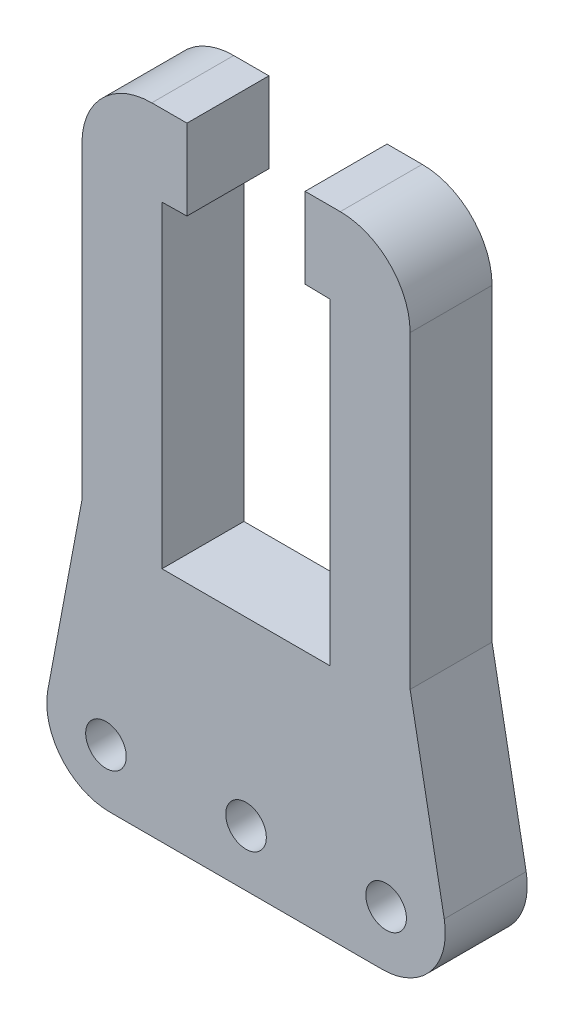
ISO-10303-21;
HEADER;
FILE_DESCRIPTION(('STEP AP214'),'2;1');
FILE_NAME('part.step','',(''),(''),'','','');
FILE_SCHEMA(('AUTOMOTIVE_DESIGN { 1 0 10303 214 1 1 1 1 }'));
ENDSEC;
DATA;
#1=APPLICATION_CONTEXT('core data for automotive mechanical design processes');
#2=APPLICATION_PROTOCOL_DEFINITION('international standard','automotive_design',2000,#1);
#3=PRODUCT_CONTEXT('',#1,'mechanical');
#4=PRODUCT('Part','Part','',(#3));
#5=PRODUCT_RELATED_PRODUCT_CATEGORY('part','',(#4));
#6=PRODUCT_DEFINITION_FORMATION('','',#4);
#7=PRODUCT_DEFINITION_CONTEXT('part definition',#1,'design');
#8=PRODUCT_DEFINITION('design','',#6,#7);
#9=PRODUCT_DEFINITION_SHAPE('','',#8);
#10=(LENGTH_UNIT() NAMED_UNIT(*) SI_UNIT(.MILLI.,.METRE.));
#11=(NAMED_UNIT(*) PLANE_ANGLE_UNIT() SI_UNIT($,.RADIAN.));
#12=(NAMED_UNIT(*) SI_UNIT($,.STERADIAN.) SOLID_ANGLE_UNIT());
#13=UNCERTAINTY_MEASURE_WITH_UNIT(LENGTH_MEASURE(1.E-05),#10,'distance_accuracy_value','');
#14=(GEOMETRIC_REPRESENTATION_CONTEXT(3) GLOBAL_UNCERTAINTY_ASSIGNED_CONTEXT((#13)) GLOBAL_UNIT_ASSIGNED_CONTEXT((#10,
#11,#12)) REPRESENTATION_CONTEXT('',''));
#15=CARTESIAN_POINT('',(0.,0.,0.));
#16=DIRECTION('',(0.,0.,1.));
#17=DIRECTION('',(1.,0.,0.));
#18=AXIS2_PLACEMENT_3D('',#15,#16,#17);
#19=CARTESIAN_POINT('',(513.253507613155,578.551691787458,5.85));
#20=DIRECTION('',(0.,0.,1.));
#21=DIRECTION('',(1.,0.,0.));
#22=AXIS2_PLACEMENT_3D('',#19,#20,#21);
#23=PLANE('',#22);
#24=CARTESIAN_POINT('',(529.982236888306,542.200965,5.85));
#25=DIRECTION('',(0.,0.,1.));
#26=DIRECTION('',(1.,0.,0.));
#27=AXIS2_PLACEMENT_3D('',#24,#25,#26);
#28=CIRCLE('',#27,1.44999989924367);
#29=CARTESIAN_POINT('',(531.43223678755,542.200965,5.85));
#30=VERTEX_POINT('',#29);
#31=EDGE_CURVE('E365',#30,#30,#28,.T.);
#32=ORIENTED_EDGE('',*,*,#31,.F.);
#33=EDGE_LOOP('',(#32));
#34=FACE_BOUND('',#33,.T.);
#35=DIRECTION('',(0.,1.,0.));
#36=VECTOR('',#35,1.);
#37=CARTESIAN_POINT('',(513.982236888306,555.093173,5.85));
#38=LINE('',#37,#36);
#39=CARTESIAN_POINT('',(513.982236888306,555.093173,5.85));
#40=VERTEX_POINT('',#39);
#41=CARTESIAN_POINT('',(513.982236888306,577.762664,5.85));
#42=VERTEX_POINT('',#41);
#43=EDGE_CURVE('E225',#40,#42,#38,.T.);
#44=ORIENTED_EDGE('',*,*,#43,.T.);
#45=DIRECTION('',(0.999863240378817,0.0165378517096973,0.));
#46=VECTOR('',#45,1.);
#47=CARTESIAN_POINT('',(513.982236888306,577.762664,5.85));
#48=LINE('',#47,#46);
#49=CARTESIAN_POINT('',(515.765416888306,577.792158,5.85));
#50=VERTEX_POINT('',#49);
#51=EDGE_CURVE('E123',#42,#50,#48,.T.);
#52=ORIENTED_EDGE('',*,*,#51,.T.);
#53=DIRECTION('',(0.,1.,0.));
#54=VECTOR('',#53,1.);
#55=CARTESIAN_POINT('',(515.765416888306,577.792158,5.85));
#56=LINE('',#55,#54);
#57=CARTESIAN_POINT('',(515.765416888306,583.538083766702,5.85));
#58=VERTEX_POINT('',#57);
#59=EDGE_CURVE('E270',#50,#58,#56,.T.);
#60=ORIENTED_EDGE('',*,*,#59,.T.);
#61=DIRECTION('',(-1.,0.,0.));
#62=VECTOR('',#61,1.);
#63=CARTESIAN_POINT('',(515.765416888306,583.538083766702,5.85));
#64=LINE('',#63,#62);
#65=CARTESIAN_POINT('',(513.253507613155,583.538083766702,5.85));
#66=VERTEX_POINT('',#65);
#67=EDGE_CURVE('E289',#58,#66,#64,.T.);
#68=ORIENTED_EDGE('',*,*,#67,.T.);
#69=CARTESIAN_POINT('',(513.253507613155,578.551691787458,5.85));
#70=DIRECTION('',(0.,0.,1.));
#71=DIRECTION('',(1.,0.,0.));
#72=AXIS2_PLACEMENT_3D('',#69,#70,#71);
#73=CIRCLE('',#72,4.98639197924405);
#74=CARTESIAN_POINT('',(508.267115633911,578.551691787458,5.85));
#75=VERTEX_POINT('',#74);
#76=EDGE_CURVE('E286',#66,#75,#73,.T.);
#77=ORIENTED_EDGE('',*,*,#76,.T.);
#78=DIRECTION('',(0.,-1.,0.));
#79=VECTOR('',#78,1.);
#80=CARTESIAN_POINT('',(508.267115633911,578.551691787458,5.85));
#81=LINE('',#80,#79);
#82=CARTESIAN_POINT('',(508.267115633911,556.488649766702,5.85));
#83=VERTEX_POINT('',#82);
#84=EDGE_CURVE('E288',#75,#83,#81,.T.);
#85=ORIENTED_EDGE('',*,*,#84,.T.);
#86=DIRECTION('',(-0.184554242554217,-0.982822329597389,0.));
#87=VECTOR('',#86,1.);
#88=CARTESIAN_POINT('',(508.267115633911,556.488649766702,5.85));
#89=LINE('',#88,#87);
#90=CARTESIAN_POINT('',(505.83136763391,543.517354766702,5.85));
#91=VERTEX_POINT('',#90);
#92=EDGE_CURVE('E291',#83,#91,#89,.T.);
#93=ORIENTED_EDGE('',*,*,#92,.T.);
#94=CARTESIAN_POINT('',(510.255750142702,542.68654482467,5.85));
#95=DIRECTION('',(0.,0.,1.));
#96=DIRECTION('',(1.,0.,0.));
#97=AXIS2_PLACEMENT_3D('',#94,#95,#96);
#98=CIRCLE('',#97,4.50171142387867);
#99=CARTESIAN_POINT('',(510.255750142702,538.184833400791,5.85));
#100=VERTEX_POINT('',#99);
#101=EDGE_CURVE('E297',#91,#100,#98,.T.);
#102=ORIENTED_EDGE('',*,*,#101,.T.);
#103=DIRECTION('',(1.,0.,0.));
#104=VECTOR('',#103,1.);
#105=CARTESIAN_POINT('',(510.255750142702,538.184833400791,5.85));
#106=LINE('',#105,#104);
#107=CARTESIAN_POINT('',(529.70872363391,538.184833400791,5.85));
#108=VERTEX_POINT('',#107);
#109=EDGE_CURVE('E299',#100,#108,#106,.T.);
#110=ORIENTED_EDGE('',*,*,#109,.T.);
#111=CARTESIAN_POINT('',(529.70872363391,542.68654482467,5.85));
#112=DIRECTION('',(0.,0.,1.));
#113=DIRECTION('',(-1.,0.,0.));
#114=AXIS2_PLACEMENT_3D('',#111,#112,#113);
#115=CIRCLE('',#114,4.50171142387867);
#116=CARTESIAN_POINT('',(534.133106142702,543.517354766702,5.85));
#117=VERTEX_POINT('',#116);
#118=EDGE_CURVE('E301',#108,#117,#115,.T.);
#119=ORIENTED_EDGE('',*,*,#118,.T.);
#120=DIRECTION('',(-0.184554242554217,0.982822329597389,0.));
#121=VECTOR('',#120,1.);
#122=CARTESIAN_POINT('',(531.697358142702,556.488649766702,5.85));
#123=LINE('',#122,#121);
#124=CARTESIAN_POINT('',(531.697358142702,556.488649766702,5.85));
#125=VERTEX_POINT('',#124);
#126=EDGE_CURVE('E303',#117,#125,#123,.T.);
#127=ORIENTED_EDGE('',*,*,#126,.T.);
#128=DIRECTION('',(0.,1.,0.));
#129=VECTOR('',#128,1.);
#130=CARTESIAN_POINT('',(531.697358142702,578.551691787458,5.85));
#131=LINE('',#130,#129);
#132=CARTESIAN_POINT('',(531.697358142702,578.551691787458,5.85));
#133=VERTEX_POINT('',#132);
#134=EDGE_CURVE('E305',#125,#133,#131,.T.);
#135=ORIENTED_EDGE('',*,*,#134,.T.);
#136=CARTESIAN_POINT('',(526.710966163458,578.551691787458,5.85));
#137=DIRECTION('',(0.,0.,1.));
#138=DIRECTION('',(-1.,0.,0.));
#139=AXIS2_PLACEMENT_3D('',#136,#137,#138);
#140=CIRCLE('',#139,4.98639197924405);
#141=CARTESIAN_POINT('',(526.710966163458,583.538083766702,5.85));
#142=VERTEX_POINT('',#141);
#143=EDGE_CURVE('E307',#133,#142,#140,.T.);
#144=ORIENTED_EDGE('',*,*,#143,.T.);
#145=DIRECTION('',(-1.,0.,0.));
#146=VECTOR('',#145,1.);
#147=CARTESIAN_POINT('',(524.199056888307,583.538083766702,5.85));
#148=LINE('',#147,#146);
#149=CARTESIAN_POINT('',(524.199056888307,583.538083766702,5.85));
#150=VERTEX_POINT('',#149);
#151=EDGE_CURVE('E309',#142,#150,#148,.T.);
#152=ORIENTED_EDGE('',*,*,#151,.T.);
#153=DIRECTION('',(0.,-1.,0.));
#154=VECTOR('',#153,1.);
#155=CARTESIAN_POINT('',(524.199056888307,577.792158,5.85));
#156=LINE('',#155,#154);
#157=CARTESIAN_POINT('',(524.199056888307,577.792158,5.85));
#158=VERTEX_POINT('',#157);
#159=EDGE_CURVE('E172',#150,#158,#156,.T.);
#160=ORIENTED_EDGE('',*,*,#159,.T.);
#161=DIRECTION('',(0.999863240378817,-0.0165378517096973,0.));
#162=VECTOR('',#161,1.);
#163=CARTESIAN_POINT('',(525.982236888306,577.762664,5.85));
#164=LINE('',#163,#162);
#165=CARTESIAN_POINT('',(525.982236888306,577.762664,5.85));
#166=VERTEX_POINT('',#165);
#167=EDGE_CURVE('E166',#158,#166,#164,.T.);
#168=ORIENTED_EDGE('',*,*,#167,.T.);
#169=DIRECTION('',(0.,-1.,0.));
#170=VECTOR('',#169,1.);
#171=CARTESIAN_POINT('',(525.982236888306,555.093173,5.85));
#172=LINE('',#171,#170);
#173=CARTESIAN_POINT('',(525.982236888306,555.093173,5.85));
#174=VERTEX_POINT('',#173);
#175=EDGE_CURVE('E170',#166,#174,#172,.T.);
#176=ORIENTED_EDGE('',*,*,#175,.T.);
#177=DIRECTION('',(-1.,0.,0.));
#178=VECTOR('',#177,1.);
#179=CARTESIAN_POINT('',(513.982236888306,555.093173,5.85));
#180=LINE('',#179,#178);
#181=EDGE_CURVE('E50',#174,#40,#180,.T.);
#182=ORIENTED_EDGE('',*,*,#181,.T.);
#183=EDGE_LOOP('',(#44,#52,#60,#68,#77,#85,#93,#102,#110,#119,#127,#135,#144,#152,#160,#168,
#176,#182));
#184=FACE_BOUND('',#183,.T.);
#185=CARTESIAN_POINT('',(519.982236888306,542.200965,5.85));
#186=DIRECTION('',(0.,0.,1.));
#187=DIRECTION('',(1.,0.,0.));
#188=AXIS2_PLACEMENT_3D('',#185,#186,#187);
#189=CIRCLE('',#188,1.45000007635058);
#190=CARTESIAN_POINT('',(521.432236964657,542.200965,5.85));
#191=VERTEX_POINT('',#190);
#192=EDGE_CURVE('E194',#191,#191,#189,.T.);
#193=ORIENTED_EDGE('',*,*,#192,.F.);
#194=EDGE_LOOP('',(#193));
#195=FACE_BOUND('',#194,.T.);
#196=CARTESIAN_POINT('',(509.982236888306,542.200965,5.85));
#197=DIRECTION('',(0.,0.,1.));
#198=DIRECTION('',(-1.,0.,0.));
#199=AXIS2_PLACEMENT_3D('',#196,#197,#198);
#200=CIRCLE('',#199,1.44999989924367);
#201=CARTESIAN_POINT('',(508.532236989063,542.200965,5.85));
#202=VERTEX_POINT('',#201);
#203=EDGE_CURVE('E356',#202,#202,#200,.T.);
#204=ORIENTED_EDGE('',*,*,#203,.F.);
#205=EDGE_LOOP('',(#204));
#206=FACE_BOUND('',#205,.T.);
#207=ADVANCED_FACE('F33',(#34,#184,#195,#206),#23,.T.);
#208=CARTESIAN_POINT('',(513.253507613155,578.551691787458,0.));
#209=DIRECTION('',(0.,0.,1.));
#210=DIRECTION('',(1.,0.,0.));
#211=AXIS2_PLACEMENT_3D('',#208,#209,#210);
#212=PLANE('',#211);
#213=CARTESIAN_POINT('',(529.982236888306,542.200965,0.));
#214=DIRECTION('',(0.,0.,1.));
#215=DIRECTION('',(1.,0.,0.));
#216=AXIS2_PLACEMENT_3D('',#213,#214,#215);
#217=CIRCLE('',#216,1.44999989924367);
#218=CARTESIAN_POINT('',(531.43223678755,542.200965,0.));
#219=VERTEX_POINT('',#218);
#220=EDGE_CURVE('E362',#219,#219,#217,.T.);
#221=ORIENTED_EDGE('',*,*,#220,.T.);
#222=EDGE_LOOP('',(#221));
#223=FACE_BOUND('',#222,.T.);
#224=DIRECTION('',(0.,1.,0.));
#225=VECTOR('',#224,1.);
#226=CARTESIAN_POINT('',(513.982236888306,555.093173,0.));
#227=LINE('',#226,#225);
#228=CARTESIAN_POINT('',(513.982236888306,555.093173,0.));
#229=VERTEX_POINT('',#228);
#230=CARTESIAN_POINT('',(513.982236888306,577.762664,0.));
#231=VERTEX_POINT('',#230);
#232=EDGE_CURVE('E190',#229,#231,#227,.T.);
#233=ORIENTED_EDGE('',*,*,#232,.F.);
#234=DIRECTION('',(-1.,0.,0.));
#235=VECTOR('',#234,1.);
#236=CARTESIAN_POINT('',(513.982236888306,555.093173,0.));
#237=LINE('',#236,#235);
#238=CARTESIAN_POINT('',(525.982236888306,555.093173,0.));
#239=VERTEX_POINT('',#238);
#240=EDGE_CURVE('E115',#239,#229,#237,.T.);
#241=ORIENTED_EDGE('',*,*,#240,.F.);
#242=DIRECTION('',(0.,-1.,0.));
#243=VECTOR('',#242,1.);
#244=CARTESIAN_POINT('',(525.982236888306,555.093173,0.));
#245=LINE('',#244,#243);
#246=CARTESIAN_POINT('',(525.982236888306,577.762664,0.));
#247=VERTEX_POINT('',#246);
#248=EDGE_CURVE('E109',#247,#239,#245,.T.);
#249=ORIENTED_EDGE('',*,*,#248,.F.);
#250=DIRECTION('',(0.999863240378817,-0.0165378517096973,0.));
#251=VECTOR('',#250,1.);
#252=CARTESIAN_POINT('',(525.982236888306,577.762664,0.));
#253=LINE('',#252,#251);
#254=CARTESIAN_POINT('',(524.199056888307,577.792158,0.));
#255=VERTEX_POINT('',#254);
#256=EDGE_CURVE('E180',#255,#247,#253,.T.);
#257=ORIENTED_EDGE('',*,*,#256,.F.);
#258=DIRECTION('',(0.,-1.,0.));
#259=VECTOR('',#258,1.);
#260=CARTESIAN_POINT('',(524.199056888307,577.792158,0.));
#261=LINE('',#260,#259);
#262=CARTESIAN_POINT('',(524.199056888307,583.538083766702,0.));
#263=VERTEX_POINT('',#262);
#264=EDGE_CURVE('E220',#263,#255,#261,.T.);
#265=ORIENTED_EDGE('',*,*,#264,.F.);
#266=DIRECTION('',(-1.,0.,0.));
#267=VECTOR('',#266,1.);
#268=CARTESIAN_POINT('',(524.199056888307,583.538083766702,0.));
#269=LINE('',#268,#267);
#270=CARTESIAN_POINT('',(526.710966163458,583.538083766702,0.));
#271=VERTEX_POINT('',#270);
#272=EDGE_CURVE('E218',#271,#263,#269,.T.);
#273=ORIENTED_EDGE('',*,*,#272,.F.);
#274=CARTESIAN_POINT('',(526.710966163458,578.551691787458,0.));
#275=DIRECTION('',(0.,0.,1.));
#276=DIRECTION('',(-1.,0.,0.));
#277=AXIS2_PLACEMENT_3D('',#274,#275,#276);
#278=CIRCLE('',#277,4.98639197924405);
#279=CARTESIAN_POINT('',(531.697358142702,578.551691787458,0.));
#280=VERTEX_POINT('',#279);
#281=EDGE_CURVE('E216',#280,#271,#278,.T.);
#282=ORIENTED_EDGE('',*,*,#281,.F.);
#283=DIRECTION('',(0.,1.,0.));
#284=VECTOR('',#283,1.);
#285=CARTESIAN_POINT('',(531.697358142702,578.551691787458,0.));
#286=LINE('',#285,#284);
#287=CARTESIAN_POINT('',(531.697358142702,556.488649766702,0.));
#288=VERTEX_POINT('',#287);
#289=EDGE_CURVE('E214',#288,#280,#286,.T.);
#290=ORIENTED_EDGE('',*,*,#289,.F.);
#291=DIRECTION('',(-0.184554242554217,0.982822329597389,0.));
#292=VECTOR('',#291,1.);
#293=CARTESIAN_POINT('',(531.697358142702,556.488649766702,0.));
#294=LINE('',#293,#292);
#295=CARTESIAN_POINT('',(534.133106142702,543.517354766702,0.));
#296=VERTEX_POINT('',#295);
#297=EDGE_CURVE('E212',#296,#288,#294,.T.);
#298=ORIENTED_EDGE('',*,*,#297,.F.);
#299=CARTESIAN_POINT('',(529.70872363391,542.68654482467,0.));
#300=DIRECTION('',(0.,0.,1.));
#301=DIRECTION('',(-1.,0.,0.));
#302=AXIS2_PLACEMENT_3D('',#299,#300,#301);
#303=CIRCLE('',#302,4.50171142387867);
#304=CARTESIAN_POINT('',(529.70872363391,538.184833400791,0.));
#305=VERTEX_POINT('',#304);
#306=EDGE_CURVE('E210',#305,#296,#303,.T.);
#307=ORIENTED_EDGE('',*,*,#306,.F.);
#308=DIRECTION('',(1.,0.,0.));
#309=VECTOR('',#308,1.);
#310=CARTESIAN_POINT('',(510.255750142702,538.184833400791,0.));
#311=LINE('',#310,#309);
#312=CARTESIAN_POINT('',(510.255750142702,538.184833400791,0.));
#313=VERTEX_POINT('',#312);
#314=EDGE_CURVE('E208',#313,#305,#311,.T.);
#315=ORIENTED_EDGE('',*,*,#314,.F.);
#316=CARTESIAN_POINT('',(510.255750142702,542.68654482467,0.));
#317=DIRECTION('',(0.,0.,1.));
#318=DIRECTION('',(1.,0.,0.));
#319=AXIS2_PLACEMENT_3D('',#316,#317,#318);
#320=CIRCLE('',#319,4.50171142387867);
#321=CARTESIAN_POINT('',(505.83136763391,543.517354766702,0.));
#322=VERTEX_POINT('',#321);
#323=EDGE_CURVE('E206',#322,#313,#320,.T.);
#324=ORIENTED_EDGE('',*,*,#323,.F.);
#325=DIRECTION('',(-0.184554242554217,-0.982822329597389,0.));
#326=VECTOR('',#325,1.);
#327=CARTESIAN_POINT('',(508.267115633911,556.488649766702,0.));
#328=LINE('',#327,#326);
#329=CARTESIAN_POINT('',(508.267115633911,556.488649766702,0.));
#330=VERTEX_POINT('',#329);
#331=EDGE_CURVE('E204',#330,#322,#328,.T.);
#332=ORIENTED_EDGE('',*,*,#331,.F.);
#333=DIRECTION('',(0.,-1.,0.));
#334=VECTOR('',#333,1.);
#335=CARTESIAN_POINT('',(508.267115633911,578.551691787458,0.));
#336=LINE('',#335,#334);
#337=CARTESIAN_POINT('',(508.267115633911,578.551691787458,0.));
#338=VERTEX_POINT('',#337);
#339=EDGE_CURVE('E202',#338,#330,#336,.T.);
#340=ORIENTED_EDGE('',*,*,#339,.F.);
#341=CARTESIAN_POINT('',(513.253507613155,578.551691787458,0.));
#342=DIRECTION('',(0.,0.,1.));
#343=DIRECTION('',(1.,0.,0.));
#344=AXIS2_PLACEMENT_3D('',#341,#342,#343);
#345=CIRCLE('',#344,4.98639197924405);
#346=CARTESIAN_POINT('',(513.253507613155,583.538083766702,0.));
#347=VERTEX_POINT('',#346);
#348=EDGE_CURVE('E200',#347,#338,#345,.T.);
#349=ORIENTED_EDGE('',*,*,#348,.F.);
#350=DIRECTION('',(-1.,0.,0.));
#351=VECTOR('',#350,1.);
#352=CARTESIAN_POINT('',(515.765416888306,583.538083766702,0.));
#353=LINE('',#352,#351);
#354=CARTESIAN_POINT('',(515.765416888306,583.538083766702,0.));
#355=VERTEX_POINT('',#354);
#356=EDGE_CURVE('E198',#355,#347,#353,.T.);
#357=ORIENTED_EDGE('',*,*,#356,.F.);
#358=DIRECTION('',(0.,1.,0.));
#359=VECTOR('',#358,1.);
#360=CARTESIAN_POINT('',(515.765416888306,577.792158,0.));
#361=LINE('',#360,#359);
#362=CARTESIAN_POINT('',(515.765416888306,577.792158,0.));
#363=VERTEX_POINT('',#362);
#364=EDGE_CURVE('E196',#363,#355,#361,.T.);
#365=ORIENTED_EDGE('',*,*,#364,.F.);
#366=DIRECTION('',(0.999863240378817,0.0165378517096973,0.));
#367=VECTOR('',#366,1.);
#368=CARTESIAN_POINT('',(513.982236888306,577.762664,0.));
#369=LINE('',#368,#367);
#370=EDGE_CURVE('E193',#231,#363,#369,.T.);
#371=ORIENTED_EDGE('',*,*,#370,.F.);
#372=EDGE_LOOP('',(#233,#241,#249,#257,#265,#273,#282,#290,#298,#307,#315,#324,#332,#340,#349,
#357,#365,#371));
#373=FACE_BOUND('',#372,.T.);
#374=CARTESIAN_POINT('',(519.982236888306,542.200965,0.));
#375=DIRECTION('',(0.,0.,1.));
#376=DIRECTION('',(1.,0.,0.));
#377=AXIS2_PLACEMENT_3D('',#374,#375,#376);
#378=CIRCLE('',#377,1.45000007635058);
#379=CARTESIAN_POINT('',(521.432236964657,542.200965,0.));
#380=VERTEX_POINT('',#379);
#381=EDGE_CURVE('E368',#380,#380,#378,.T.);
#382=ORIENTED_EDGE('',*,*,#381,.T.);
#383=EDGE_LOOP('',(#382));
#384=FACE_BOUND('',#383,.T.);
#385=CARTESIAN_POINT('',(509.982236888306,542.200965,0.));
#386=DIRECTION('',(0.,0.,1.));
#387=DIRECTION('',(-1.,0.,0.));
#388=AXIS2_PLACEMENT_3D('',#385,#386,#387);
#389=CIRCLE('',#388,1.44999989924367);
#390=CARTESIAN_POINT('',(508.532236989063,542.200965,0.));
#391=VERTEX_POINT('',#390);
#392=EDGE_CURVE('E359',#391,#391,#389,.T.);
#393=ORIENTED_EDGE('',*,*,#392,.T.);
#394=EDGE_LOOP('',(#393));
#395=FACE_BOUND('',#394,.T.);
#396=ADVANCED_FACE('F274',(#223,#373,#384,#395),#212,.F.);
#397=CARTESIAN_POINT('',(513.982236888306,555.093173,5.85));
#398=DIRECTION('',(-1.,0.,0.));
#399=DIRECTION('',(0.,0.,1.));
#400=AXIS2_PLACEMENT_3D('',#397,#398,#399);
#401=PLANE('',#400);
#402=ORIENTED_EDGE('',*,*,#232,.T.);
#403=DIRECTION('',(0.,0.,-1.));
#404=VECTOR('',#403,1.);
#405=CARTESIAN_POINT('',(513.982236888306,577.762664,5.85));
#406=LINE('',#405,#404);
#407=EDGE_CURVE('E11',#42,#231,#406,.T.);
#408=ORIENTED_EDGE('',*,*,#407,.F.);
#409=ORIENTED_EDGE('',*,*,#43,.F.);
#410=DIRECTION('',(0.,0.,-1.));
#411=VECTOR('',#410,1.);
#412=CARTESIAN_POINT('',(513.982236888306,555.093173,5.85));
#413=LINE('',#412,#411);
#414=EDGE_CURVE('E186',#40,#229,#413,.T.);
#415=ORIENTED_EDGE('',*,*,#414,.T.);
#416=EDGE_LOOP('',(#402,#408,#409,#415));
#417=FACE_BOUND('',#416,.T.);
#418=ADVANCED_FACE('F35',(#417),#401,.F.);
#419=CARTESIAN_POINT('',(513.982236888306,577.762664,5.85));
#420=DIRECTION('',(-0.0165378517096973,0.999863240378817,0.));
#421=DIRECTION('',(-0.999863240378817,-0.0165378517096973,0.));
#422=AXIS2_PLACEMENT_3D('',#419,#420,#421);
#423=PLANE('',#422);
#424=ORIENTED_EDGE('',*,*,#370,.T.);
#425=DIRECTION('',(0.,0.,-1.));
#426=VECTOR('',#425,1.);
#427=CARTESIAN_POINT('',(515.765416888306,577.792158,5.85));
#428=LINE('',#427,#426);
#429=EDGE_CURVE('E42',#50,#363,#428,.T.);
#430=ORIENTED_EDGE('',*,*,#429,.F.);
#431=ORIENTED_EDGE('',*,*,#51,.F.);
#432=ORIENTED_EDGE('',*,*,#407,.T.);
#433=EDGE_LOOP('',(#424,#430,#431,#432));
#434=FACE_BOUND('',#433,.T.);
#435=ADVANCED_FACE('F529',(#434),#423,.F.);
#436=CARTESIAN_POINT('',(515.765416888306,577.792158,5.85));
#437=DIRECTION('',(-1.,0.,0.));
#438=DIRECTION('',(0.,0.,1.));
#439=AXIS2_PLACEMENT_3D('',#436,#437,#438);
#440=PLANE('',#439);
#441=ORIENTED_EDGE('',*,*,#364,.T.);
#442=DIRECTION('',(0.,0.,-1.));
#443=VECTOR('',#442,1.);
#444=CARTESIAN_POINT('',(515.765416888306,583.538083766702,5.85));
#445=LINE('',#444,#443);
#446=EDGE_CURVE('E262',#58,#355,#445,.T.);
#447=ORIENTED_EDGE('',*,*,#446,.F.);
#448=ORIENTED_EDGE('',*,*,#59,.F.);
#449=ORIENTED_EDGE('',*,*,#429,.T.);
#450=EDGE_LOOP('',(#441,#447,#448,#449));
#451=FACE_BOUND('',#450,.T.);
#452=ADVANCED_FACE('F268',(#451),#440,.F.);
#453=CARTESIAN_POINT('',(515.765416888306,583.538083766702,5.85));
#454=DIRECTION('',(0.,-1.,0.));
#455=DIRECTION('',(1.,0.,0.));
#456=AXIS2_PLACEMENT_3D('',#453,#454,#455);
#457=PLANE('',#456);
#458=ORIENTED_EDGE('',*,*,#356,.T.);
#459=DIRECTION('',(0.,0.,-1.));
#460=VECTOR('',#459,1.);
#461=CARTESIAN_POINT('',(513.253507613155,583.538083766702,5.85));
#462=LINE('',#461,#460);
#463=EDGE_CURVE('E259',#66,#347,#462,.T.);
#464=ORIENTED_EDGE('',*,*,#463,.F.);
#465=ORIENTED_EDGE('',*,*,#67,.F.);
#466=ORIENTED_EDGE('',*,*,#446,.T.);
#467=EDGE_LOOP('',(#458,#464,#465,#466));
#468=FACE_BOUND('',#467,.T.);
#469=ADVANCED_FACE('F280',(#468),#457,.F.);
#470=CARTESIAN_POINT('',(513.253507613155,578.551691787458,5.85));
#471=DIRECTION('',(0.,0.,-1.));
#472=DIRECTION('',(-1.,0.,0.));
#473=AXIS2_PLACEMENT_3D('',#470,#471,#472);
#474=CYLINDRICAL_SURFACE('',#473,4.98639197924405);
#475=ORIENTED_EDGE('',*,*,#348,.T.);
#476=DIRECTION('',(0.,0.,-1.));
#477=VECTOR('',#476,1.);
#478=CARTESIAN_POINT('',(508.267115633911,578.551691787458,5.85));
#479=LINE('',#478,#477);
#480=EDGE_CURVE('E256',#75,#338,#479,.T.);
#481=ORIENTED_EDGE('',*,*,#480,.F.);
#482=ORIENTED_EDGE('',*,*,#76,.F.);
#483=ORIENTED_EDGE('',*,*,#463,.T.);
#484=EDGE_LOOP('',(#475,#481,#482,#483));
#485=FACE_BOUND('',#484,.T.);
#486=ADVANCED_FACE('F284',(#485),#474,.T.);
#487=CARTESIAN_POINT('',(508.267115633911,578.551691787458,5.85));
#488=DIRECTION('',(1.,0.,0.));
#489=DIRECTION('',(0.,0.,-1.));
#490=AXIS2_PLACEMENT_3D('',#487,#488,#489);
#491=PLANE('',#490);
#492=ORIENTED_EDGE('',*,*,#339,.T.);
#493=DIRECTION('',(0.,0.,-1.));
#494=VECTOR('',#493,1.);
#495=CARTESIAN_POINT('',(508.267115633911,556.488649766702,5.85));
#496=LINE('',#495,#494);
#497=EDGE_CURVE('E253',#83,#330,#496,.T.);
#498=ORIENTED_EDGE('',*,*,#497,.F.);
#499=ORIENTED_EDGE('',*,*,#84,.F.);
#500=ORIENTED_EDGE('',*,*,#480,.T.);
#501=EDGE_LOOP('',(#492,#498,#499,#500));
#502=FACE_BOUND('',#501,.T.);
#503=ADVANCED_FACE('F494',(#502),#491,.F.);
#504=CARTESIAN_POINT('',(508.267115633911,556.488649766702,5.85));
#505=DIRECTION('',(0.982822329597389,-0.184554242554217,0.));
#506=DIRECTION('',(0.184554242554217,0.982822329597389,0.));
#507=AXIS2_PLACEMENT_3D('',#504,#505,#506);
#508=PLANE('',#507);
#509=ORIENTED_EDGE('',*,*,#331,.T.);
#510=DIRECTION('',(0.,0.,-1.));
#511=VECTOR('',#510,1.);
#512=CARTESIAN_POINT('',(505.83136763391,543.517354766702,5.85));
#513=LINE('',#512,#511);
#514=EDGE_CURVE('E250',#91,#322,#513,.T.);
#515=ORIENTED_EDGE('',*,*,#514,.F.);
#516=ORIENTED_EDGE('',*,*,#92,.F.);
#517=ORIENTED_EDGE('',*,*,#497,.T.);
#518=EDGE_LOOP('',(#509,#515,#516,#517));
#519=FACE_BOUND('',#518,.T.);
#520=ADVANCED_FACE('F484',(#519),#508,.F.);
#521=CARTESIAN_POINT('',(510.255750142702,542.68654482467,5.85));
#522=DIRECTION('',(0.,0.,-1.));
#523=DIRECTION('',(-1.,0.,0.));
#524=AXIS2_PLACEMENT_3D('',#521,#522,#523);
#525=CYLINDRICAL_SURFACE('',#524,4.50171142387867);
#526=ORIENTED_EDGE('',*,*,#323,.T.);
#527=DIRECTION('',(0.,0.,-1.));
#528=VECTOR('',#527,1.);
#529=CARTESIAN_POINT('',(510.255750142702,538.184833400791,5.85));
#530=LINE('',#529,#528);
#531=EDGE_CURVE('E247',#100,#313,#530,.T.);
#532=ORIENTED_EDGE('',*,*,#531,.F.);
#533=ORIENTED_EDGE('',*,*,#101,.F.);
#534=ORIENTED_EDGE('',*,*,#514,.T.);
#535=EDGE_LOOP('',(#526,#532,#533,#534));
#536=FACE_BOUND('',#535,.T.);
#537=ADVANCED_FACE('F474',(#536),#525,.T.);
#538=CARTESIAN_POINT('',(510.255750142702,538.184833400791,5.85));
#539=DIRECTION('',(0.,1.,0.));
#540=DIRECTION('',(0.,0.,1.));
#541=AXIS2_PLACEMENT_3D('',#538,#539,#540);
#542=PLANE('',#541);
#543=ORIENTED_EDGE('',*,*,#314,.T.);
#544=DIRECTION('',(0.,0.,-1.));
#545=VECTOR('',#544,1.);
#546=CARTESIAN_POINT('',(529.70872363391,538.184833400791,5.85));
#547=LINE('',#546,#545);
#548=EDGE_CURVE('E244',#108,#305,#547,.T.);
#549=ORIENTED_EDGE('',*,*,#548,.F.);
#550=ORIENTED_EDGE('',*,*,#109,.F.);
#551=ORIENTED_EDGE('',*,*,#531,.T.);
#552=EDGE_LOOP('',(#543,#549,#550,#551));
#553=FACE_BOUND('',#552,.T.);
#554=ADVANCED_FACE('F464',(#553),#542,.F.);
#555=CARTESIAN_POINT('',(529.70872363391,542.68654482467,5.85));
#556=DIRECTION('',(0.,0.,-1.));
#557=DIRECTION('',(-1.,0.,0.));
#558=AXIS2_PLACEMENT_3D('',#555,#556,#557);
#559=CYLINDRICAL_SURFACE('',#558,4.50171142387867);
#560=ORIENTED_EDGE('',*,*,#306,.T.);
#561=DIRECTION('',(0.,0.,-1.));
#562=VECTOR('',#561,1.);
#563=CARTESIAN_POINT('',(534.133106142702,543.517354766702,5.85));
#564=LINE('',#563,#562);
#565=EDGE_CURVE('E241',#117,#296,#564,.T.);
#566=ORIENTED_EDGE('',*,*,#565,.F.);
#567=ORIENTED_EDGE('',*,*,#118,.F.);
#568=ORIENTED_EDGE('',*,*,#548,.T.);
#569=EDGE_LOOP('',(#560,#566,#567,#568));
#570=FACE_BOUND('',#569,.T.);
#571=ADVANCED_FACE('F454',(#570),#559,.T.);
#572=CARTESIAN_POINT('',(531.697358142702,556.488649766702,5.85));
#573=DIRECTION('',(-0.982822329597389,-0.184554242554217,0.));
#574=DIRECTION('',(0.184554242554217,-0.982822329597389,0.));
#575=AXIS2_PLACEMENT_3D('',#572,#573,#574);
#576=PLANE('',#575);
#577=ORIENTED_EDGE('',*,*,#297,.T.);
#578=DIRECTION('',(0.,0.,-1.));
#579=VECTOR('',#578,1.);
#580=CARTESIAN_POINT('',(531.697358142702,556.488649766702,5.85));
#581=LINE('',#580,#579);
#582=EDGE_CURVE('E238',#125,#288,#581,.T.);
#583=ORIENTED_EDGE('',*,*,#582,.F.);
#584=ORIENTED_EDGE('',*,*,#126,.F.);
#585=ORIENTED_EDGE('',*,*,#565,.T.);
#586=EDGE_LOOP('',(#577,#583,#584,#585));
#587=FACE_BOUND('',#586,.T.);
#588=ADVANCED_FACE('F444',(#587),#576,.F.);
#589=CARTESIAN_POINT('',(531.697358142702,578.551691787458,5.85));
#590=DIRECTION('',(-1.,0.,0.));
#591=DIRECTION('',(0.,0.,1.));
#592=AXIS2_PLACEMENT_3D('',#589,#590,#591);
#593=PLANE('',#592);
#594=ORIENTED_EDGE('',*,*,#289,.T.);
#595=DIRECTION('',(0.,0.,-1.));
#596=VECTOR('',#595,1.);
#597=CARTESIAN_POINT('',(531.697358142702,578.551691787458,5.85));
#598=LINE('',#597,#596);
#599=EDGE_CURVE('E235',#133,#280,#598,.T.);
#600=ORIENTED_EDGE('',*,*,#599,.F.);
#601=ORIENTED_EDGE('',*,*,#134,.F.);
#602=ORIENTED_EDGE('',*,*,#582,.T.);
#603=EDGE_LOOP('',(#594,#600,#601,#602));
#604=FACE_BOUND('',#603,.T.);
#605=ADVANCED_FACE('F434',(#604),#593,.F.);
#606=CARTESIAN_POINT('',(526.710966163458,578.551691787458,5.85));
#607=DIRECTION('',(0.,0.,-1.));
#608=DIRECTION('',(-1.,0.,0.));
#609=AXIS2_PLACEMENT_3D('',#606,#607,#608);
#610=CYLINDRICAL_SURFACE('',#609,4.98639197924405);
#611=ORIENTED_EDGE('',*,*,#281,.T.);
#612=DIRECTION('',(0.,0.,-1.));
#613=VECTOR('',#612,1.);
#614=CARTESIAN_POINT('',(526.710966163458,583.538083766702,5.85));
#615=LINE('',#614,#613);
#616=EDGE_CURVE('E232',#142,#271,#615,.T.);
#617=ORIENTED_EDGE('',*,*,#616,.F.);
#618=ORIENTED_EDGE('',*,*,#143,.F.);
#619=ORIENTED_EDGE('',*,*,#599,.T.);
#620=EDGE_LOOP('',(#611,#617,#618,#619));
#621=FACE_BOUND('',#620,.T.);
#622=ADVANCED_FACE('F425',(#621),#610,.T.);
#623=CARTESIAN_POINT('',(524.199056888307,583.538083766702,5.85));
#624=DIRECTION('',(0.,-1.,0.));
#625=DIRECTION('',(1.,0.,0.));
#626=AXIS2_PLACEMENT_3D('',#623,#624,#625);
#627=PLANE('',#626);
#628=ORIENTED_EDGE('',*,*,#272,.T.);
#629=DIRECTION('',(0.,0.,-1.));
#630=VECTOR('',#629,1.);
#631=CARTESIAN_POINT('',(524.199056888307,583.538083766702,5.85));
#632=LINE('',#631,#630);
#633=EDGE_CURVE('E229',#150,#263,#632,.T.);
#634=ORIENTED_EDGE('',*,*,#633,.F.);
#635=ORIENTED_EDGE('',*,*,#151,.F.);
#636=ORIENTED_EDGE('',*,*,#616,.T.);
#637=EDGE_LOOP('',(#628,#634,#635,#636));
#638=FACE_BOUND('',#637,.T.);
#639=ADVANCED_FACE('F315',(#638),#627,.F.);
#640=CARTESIAN_POINT('',(524.199056888307,577.792158,5.85));
#641=DIRECTION('',(1.,0.,0.));
#642=DIRECTION('',(0.,0.,-1.));
#643=AXIS2_PLACEMENT_3D('',#640,#641,#642);
#644=PLANE('',#643);
#645=ORIENTED_EDGE('',*,*,#264,.T.);
#646=DIRECTION('',(0.,0.,-1.));
#647=VECTOR('',#646,1.);
#648=CARTESIAN_POINT('',(524.199056888307,577.792158,5.85));
#649=LINE('',#648,#647);
#650=EDGE_CURVE('E181',#158,#255,#649,.T.);
#651=ORIENTED_EDGE('',*,*,#650,.F.);
#652=ORIENTED_EDGE('',*,*,#159,.F.);
#653=ORIENTED_EDGE('',*,*,#633,.T.);
#654=EDGE_LOOP('',(#645,#651,#652,#653));
#655=FACE_BOUND('',#654,.T.);
#656=ADVANCED_FACE('F319',(#655),#644,.F.);
#657=CARTESIAN_POINT('',(525.982236888306,577.762664,5.85));
#658=DIRECTION('',(0.0165378517096973,0.999863240378817,0.));
#659=DIRECTION('',(-0.999863240378817,0.0165378517096973,0.));
#660=AXIS2_PLACEMENT_3D('',#657,#658,#659);
#661=PLANE('',#660);
#662=ORIENTED_EDGE('',*,*,#256,.T.);
#663=DIRECTION('',(0.,0.,-1.));
#664=VECTOR('',#663,1.);
#665=CARTESIAN_POINT('',(525.982236888306,577.762664,5.85));
#666=LINE('',#665,#664);
#667=EDGE_CURVE('E177',#166,#247,#666,.T.);
#668=ORIENTED_EDGE('',*,*,#667,.F.);
#669=ORIENTED_EDGE('',*,*,#167,.F.);
#670=ORIENTED_EDGE('',*,*,#650,.T.);
#671=EDGE_LOOP('',(#662,#668,#669,#670));
#672=FACE_BOUND('',#671,.T.);
#673=ADVANCED_FACE('F178',(#672),#661,.F.);
#674=CARTESIAN_POINT('',(525.982236888306,555.093173,5.85));
#675=DIRECTION('',(1.,0.,0.));
#676=DIRECTION('',(0.,0.,-1.));
#677=AXIS2_PLACEMENT_3D('',#674,#675,#676);
#678=PLANE('',#677);
#679=ORIENTED_EDGE('',*,*,#248,.T.);
#680=DIRECTION('',(0.,0.,-1.));
#681=VECTOR('',#680,1.);
#682=CARTESIAN_POINT('',(525.982236888306,555.093173,5.85));
#683=LINE('',#682,#681);
#684=EDGE_CURVE('E182',#174,#239,#683,.T.);
#685=ORIENTED_EDGE('',*,*,#684,.F.);
#686=ORIENTED_EDGE('',*,*,#175,.F.);
#687=ORIENTED_EDGE('',*,*,#667,.T.);
#688=EDGE_LOOP('',(#679,#685,#686,#687));
#689=FACE_BOUND('',#688,.T.);
#690=ADVANCED_FACE('F184',(#689),#678,.F.);
#691=CARTESIAN_POINT('',(513.982236888306,555.093173,5.85));
#692=DIRECTION('',(0.,-1.,0.));
#693=DIRECTION('',(0.,0.,-1.));
#694=AXIS2_PLACEMENT_3D('',#691,#692,#693);
#695=PLANE('',#694);
#696=ORIENTED_EDGE('',*,*,#240,.T.);
#697=ORIENTED_EDGE('',*,*,#414,.F.);
#698=ORIENTED_EDGE('',*,*,#181,.F.);
#699=ORIENTED_EDGE('',*,*,#684,.T.);
#700=EDGE_LOOP('',(#696,#697,#698,#699));
#701=FACE_BOUND('',#700,.T.);
#702=ADVANCED_FACE('F323',(#701),#695,.F.);
#703=CARTESIAN_POINT('',(519.982236888306,542.200965,5.85));
#704=DIRECTION('',(0.,0.,-1.));
#705=DIRECTION('',(-1.,0.,0.));
#706=AXIS2_PLACEMENT_3D('',#703,#704,#705);
#707=CYLINDRICAL_SURFACE('',#706,1.45000007635058);
#708=ORIENTED_EDGE('',*,*,#192,.T.);
#709=EDGE_LOOP('',(#708));
#710=FACE_BOUND('',#709,.T.);
#711=ORIENTED_EDGE('',*,*,#381,.F.);
#712=EDGE_LOOP('',(#711));
#713=FACE_BOUND('',#712,.T.);
#714=ADVANCED_FACE('F325',(#710,#713),#707,.F.);
#715=CARTESIAN_POINT('',(529.982236888306,542.200965,5.85));
#716=DIRECTION('',(0.,0.,-1.));
#717=DIRECTION('',(-1.,0.,0.));
#718=AXIS2_PLACEMENT_3D('',#715,#716,#717);
#719=CYLINDRICAL_SURFACE('',#718,1.44999989924367);
#720=ORIENTED_EDGE('',*,*,#31,.T.);
#721=EDGE_LOOP('',(#720));
#722=FACE_BOUND('',#721,.T.);
#723=ORIENTED_EDGE('',*,*,#220,.F.);
#724=EDGE_LOOP('',(#723));
#725=FACE_BOUND('',#724,.T.);
#726=ADVANCED_FACE('F331',(#722,#725),#719,.F.);
#727=CARTESIAN_POINT('',(509.982236888306,542.200965,5.85));
#728=DIRECTION('',(0.,0.,-1.));
#729=DIRECTION('',(-1.,0.,0.));
#730=AXIS2_PLACEMENT_3D('',#727,#728,#729);
#731=CYLINDRICAL_SURFACE('',#730,1.44999989924367);
#732=ORIENTED_EDGE('',*,*,#203,.T.);
#733=EDGE_LOOP('',(#732));
#734=FACE_BOUND('',#733,.T.);
#735=ORIENTED_EDGE('',*,*,#392,.F.);
#736=EDGE_LOOP('',(#735));
#737=FACE_BOUND('',#736,.T.);
#738=ADVANCED_FACE('F347',(#734,#737),#731,.F.);
#739=CLOSED_SHELL('',(#207,#396,#418,#435,#452,#469,#486,#503,#520,#537,#554,#571,#588,#605,
#622,#639,#656,#673,#690,#702,#714,#726,#738));
#740=MANIFOLD_SOLID_BREP('B2',#739);
#741=ADVANCED_BREP_SHAPE_REPRESENTATION('',(#18,#740),#14);
#742=SHAPE_DEFINITION_REPRESENTATION(#9,#741);
ENDSEC;
END-ISO-10303-21;
